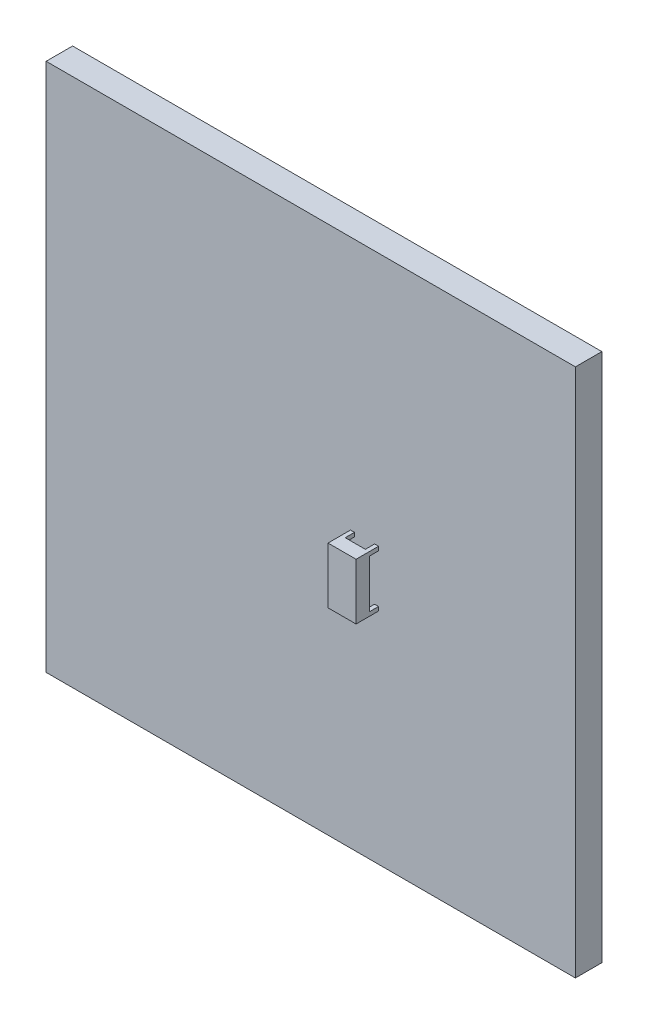
ISO-10303-21;
HEADER;
FILE_DESCRIPTION(('STEP AP214'),'2;1');
FILE_NAME('part.step','',(''),(''),'','','');
FILE_SCHEMA(('AUTOMOTIVE_DESIGN { 1 0 10303 214 1 1 1 1 }'));
ENDSEC;
DATA;
#1=APPLICATION_CONTEXT('core data for automotive mechanical design processes');
#2=APPLICATION_PROTOCOL_DEFINITION('international standard','automotive_design',2000,#1);
#3=PRODUCT_CONTEXT('',#1,'mechanical');
#4=PRODUCT('Part','Part','',(#3));
#5=PRODUCT_RELATED_PRODUCT_CATEGORY('part','',(#4));
#6=PRODUCT_DEFINITION_FORMATION('','',#4);
#7=PRODUCT_DEFINITION_CONTEXT('part definition',#1,'design');
#8=PRODUCT_DEFINITION('design','',#6,#7);
#9=PRODUCT_DEFINITION_SHAPE('','',#8);
#10=(LENGTH_UNIT() NAMED_UNIT(*) SI_UNIT(.MILLI.,.METRE.));
#11=(NAMED_UNIT(*) PLANE_ANGLE_UNIT() SI_UNIT($,.RADIAN.));
#12=(NAMED_UNIT(*) SI_UNIT($,.STERADIAN.) SOLID_ANGLE_UNIT());
#13=UNCERTAINTY_MEASURE_WITH_UNIT(LENGTH_MEASURE(1.E-05),#10,'distance_accuracy_value','');
#14=(GEOMETRIC_REPRESENTATION_CONTEXT(3) GLOBAL_UNCERTAINTY_ASSIGNED_CONTEXT((#13)) GLOBAL_UNIT_ASSIGNED_CONTEXT((#10,
#11,#12)) REPRESENTATION_CONTEXT('',''));
#15=CARTESIAN_POINT('',(0.,0.,0.));
#16=DIRECTION('',(0.,0.,1.));
#17=DIRECTION('',(1.,0.,0.));
#18=AXIS2_PLACEMENT_3D('',#15,#16,#17);
#19=CARTESIAN_POINT('',(0.,0.,0.));
#20=DIRECTION('',(0.,0.,-1.));
#21=DIRECTION('',(-1.,0.,0.));
#22=AXIS2_PLACEMENT_3D('',#19,#20,#21);
#23=PLANE('',#22);
#24=DIRECTION('',(-1.,0.,0.));
#25=VECTOR('',#24,1.);
#26=CARTESIAN_POINT('',(2561.96926289424,-1710.1252122321,0.));
#27=LINE('',#26,#25);
#28=CARTESIAN_POINT('',(2561.96926289424,-1710.1252122321,0.));
#29=VERTEX_POINT('',#28);
#30=CARTESIAN_POINT('',(2411.96926289424,-1710.1252122321,0.));
#31=VERTEX_POINT('',#30);
#32=EDGE_CURVE('E207',#29,#31,#27,.T.);
#33=ORIENTED_EDGE('',*,*,#32,.T.);
#34=DIRECTION('',(0.,1.,0.));
#35=VECTOR('',#34,1.);
#36=CARTESIAN_POINT('',(2411.96926289424,-1710.1252122321,0.));
#37=LINE('',#36,#35);
#38=CARTESIAN_POINT('',(2411.96926289424,-1560.1252122321,0.));
#39=VERTEX_POINT('',#38);
#40=EDGE_CURVE('E209',#31,#39,#37,.T.);
#41=ORIENTED_EDGE('',*,*,#40,.T.);
#42=DIRECTION('',(1.,0.,0.));
#43=VECTOR('',#42,1.);
#44=CARTESIAN_POINT('',(2561.96926289424,-1560.1252122321,0.));
#45=LINE('',#44,#43);
#46=CARTESIAN_POINT('',(2561.96926289424,-1560.1252122321,0.));
#47=VERTEX_POINT('',#46);
#48=EDGE_CURVE('E202',#39,#47,#45,.T.);
#49=ORIENTED_EDGE('',*,*,#48,.T.);
#50=DIRECTION('',(0.,-1.,0.));
#51=VECTOR('',#50,1.);
#52=CARTESIAN_POINT('',(2561.96926289424,-1710.1252122321,0.));
#53=LINE('',#52,#51);
#54=EDGE_CURVE('E203',#47,#29,#53,.T.);
#55=ORIENTED_EDGE('',*,*,#54,.T.);
#56=EDGE_LOOP('',(#33,#41,#49,#55));
#57=FACE_BOUND('',#56,.T.);
#58=DIRECTION('',(-1.,0.,0.));
#59=VECTOR('',#58,1.);
#60=CARTESIAN_POINT('',(2561.96926289424,260.125212232101,0.));
#61=LINE('',#60,#59);
#62=CARTESIAN_POINT('',(2561.96926289424,260.125212232101,0.));
#63=VERTEX_POINT('',#62);
#64=CARTESIAN_POINT('',(2411.96926289424,260.125212232101,0.));
#65=VERTEX_POINT('',#64);
#66=EDGE_CURVE('E292',#63,#65,#61,.T.);
#67=ORIENTED_EDGE('',*,*,#66,.T.);
#68=DIRECTION('',(0.,1.,0.));
#69=VECTOR('',#68,1.);
#70=CARTESIAN_POINT('',(2411.96926289424,410.125212232101,0.));
#71=LINE('',#70,#69);
#72=CARTESIAN_POINT('',(2411.96926289424,410.125212232101,0.));
#73=VERTEX_POINT('',#72);
#74=EDGE_CURVE('E290',#65,#73,#71,.T.);
#75=ORIENTED_EDGE('',*,*,#74,.T.);
#76=DIRECTION('',(1.,0.,0.));
#77=VECTOR('',#76,1.);
#78=CARTESIAN_POINT('',(2561.96926289424,410.125212232101,0.));
#79=LINE('',#78,#77);
#80=CARTESIAN_POINT('',(2561.96926289424,410.125212232101,0.));
#81=VERTEX_POINT('',#80);
#82=EDGE_CURVE('E287',#73,#81,#79,.T.);
#83=ORIENTED_EDGE('',*,*,#82,.T.);
#84=DIRECTION('',(0.,-1.,0.));
#85=VECTOR('',#84,1.);
#86=CARTESIAN_POINT('',(2561.96926289424,410.125212232101,0.));
#87=LINE('',#86,#85);
#88=EDGE_CURVE('E279',#81,#63,#87,.T.);
#89=ORIENTED_EDGE('',*,*,#88,.T.);
#90=EDGE_LOOP('',(#67,#75,#83,#89));
#91=FACE_BOUND('',#90,.T.);
#92=DIRECTION('',(0.,1.,0.));
#93=VECTOR('',#92,1.);
#94=CARTESIAN_POINT('',(10000.,-10000.,0.));
#95=LINE('',#94,#93);
#96=CARTESIAN_POINT('',(10000.,-10000.,0.));
#97=VERTEX_POINT('',#96);
#98=CARTESIAN_POINT('',(10000.,10000.,0.));
#99=VERTEX_POINT('',#98);
#100=EDGE_CURVE('E289',#97,#99,#95,.T.);
#101=ORIENTED_EDGE('',*,*,#100,.T.);
#102=DIRECTION('',(-1.,0.,0.));
#103=VECTOR('',#102,1.);
#104=CARTESIAN_POINT('',(-10000.,10000.,0.));
#105=LINE('',#104,#103);
#106=CARTESIAN_POINT('',(-10000.,10000.,0.));
#107=VERTEX_POINT('',#106);
#108=EDGE_CURVE('E310',#99,#107,#105,.T.);
#109=ORIENTED_EDGE('',*,*,#108,.T.);
#110=DIRECTION('',(0.,-1.,0.));
#111=VECTOR('',#110,1.);
#112=CARTESIAN_POINT('',(-10000.,-10000.,0.));
#113=LINE('',#112,#111);
#114=CARTESIAN_POINT('',(-10000.,-10000.,0.));
#115=VERTEX_POINT('',#114);
#116=EDGE_CURVE('E313',#107,#115,#113,.T.);
#117=ORIENTED_EDGE('',*,*,#116,.T.);
#118=DIRECTION('',(1.,0.,0.));
#119=VECTOR('',#118,1.);
#120=CARTESIAN_POINT('',(-10000.,-10000.,0.));
#121=LINE('',#120,#119);
#122=EDGE_CURVE('E299',#115,#97,#121,.T.);
#123=ORIENTED_EDGE('',*,*,#122,.T.);
#124=EDGE_LOOP('',(#101,#109,#117,#123));
#125=FACE_BOUND('',#124,.T.);
#126=DIRECTION('',(1.,0.,0.));
#127=VECTOR('',#126,1.);
#128=CARTESIAN_POINT('',(1501.84405066214,410.125212232101,0.));
#129=LINE('',#128,#127);
#130=CARTESIAN_POINT('',(1501.84405066214,410.125212232101,0.));
#131=VERTEX_POINT('',#130);
#132=CARTESIAN_POINT('',(1651.84405066214,410.125212232101,0.));
#133=VERTEX_POINT('',#132);
#134=EDGE_CURVE('E229',#131,#133,#129,.T.);
#135=ORIENTED_EDGE('',*,*,#134,.T.);
#136=DIRECTION('',(0.,-1.,0.));
#137=VECTOR('',#136,1.);
#138=CARTESIAN_POINT('',(1651.84405066214,410.125212232101,0.));
#139=LINE('',#138,#137);
#140=CARTESIAN_POINT('',(1651.84405066214,260.125212232101,0.));
#141=VERTEX_POINT('',#140);
#142=EDGE_CURVE('E231',#133,#141,#139,.T.);
#143=ORIENTED_EDGE('',*,*,#142,.T.);
#144=DIRECTION('',(-1.,0.,0.));
#145=VECTOR('',#144,1.);
#146=CARTESIAN_POINT('',(1501.84405066214,260.125212232101,0.));
#147=LINE('',#146,#145);
#148=CARTESIAN_POINT('',(1501.84405066214,260.125212232101,0.));
#149=VERTEX_POINT('',#148);
#150=EDGE_CURVE('E222',#141,#149,#147,.T.);
#151=ORIENTED_EDGE('',*,*,#150,.T.);
#152=DIRECTION('',(0.,1.,0.));
#153=VECTOR('',#152,1.);
#154=CARTESIAN_POINT('',(1501.84405066214,410.125212232101,0.));
#155=LINE('',#154,#153);
#156=EDGE_CURVE('E225',#149,#131,#155,.T.);
#157=ORIENTED_EDGE('',*,*,#156,.T.);
#158=EDGE_LOOP('',(#135,#143,#151,#157));
#159=FACE_BOUND('',#158,.T.);
#160=DIRECTION('',(1.,0.,0.));
#161=VECTOR('',#160,1.);
#162=CARTESIAN_POINT('',(1501.84405066214,-1560.1252122321,0.));
#163=LINE('',#162,#161);
#164=CARTESIAN_POINT('',(1501.84405066214,-1560.1252122321,0.));
#165=VERTEX_POINT('',#164);
#166=CARTESIAN_POINT('',(1651.84405066214,-1560.1252122321,0.));
#167=VERTEX_POINT('',#166);
#168=EDGE_CURVE('E60',#165,#167,#163,.T.);
#169=ORIENTED_EDGE('',*,*,#168,.T.);
#170=DIRECTION('',(0.,-1.,0.));
#171=VECTOR('',#170,1.);
#172=CARTESIAN_POINT('',(1651.84405066214,-1710.1252122321,0.));
#173=LINE('',#172,#171);
#174=CARTESIAN_POINT('',(1651.84405066214,-1710.1252122321,0.));
#175=VERTEX_POINT('',#174);
#176=EDGE_CURVE('E173',#167,#175,#173,.T.);
#177=ORIENTED_EDGE('',*,*,#176,.T.);
#178=DIRECTION('',(-1.,0.,0.));
#179=VECTOR('',#178,1.);
#180=CARTESIAN_POINT('',(1501.84405066214,-1710.1252122321,0.));
#181=LINE('',#180,#179);
#182=CARTESIAN_POINT('',(1501.84405066214,-1710.1252122321,0.));
#183=VERTEX_POINT('',#182);
#184=EDGE_CURVE('E175',#175,#183,#181,.T.);
#185=ORIENTED_EDGE('',*,*,#184,.T.);
#186=DIRECTION('',(0.,1.,0.));
#187=VECTOR('',#186,1.);
#188=CARTESIAN_POINT('',(1501.84405066214,-1710.1252122321,0.));
#189=LINE('',#188,#187);
#190=EDGE_CURVE('E56',#183,#165,#189,.T.);
#191=ORIENTED_EDGE('',*,*,#190,.T.);
#192=EDGE_LOOP('',(#169,#177,#185,#191));
#193=FACE_BOUND('',#192,.T.);
#194=ADVANCED_FACE('F39',(#57,#91,#125,#159,#193),#23,.F.);
#195=CARTESIAN_POINT('',(0.,0.,350.));
#196=DIRECTION('',(0.,0.,-1.));
#197=DIRECTION('',(-1.,0.,0.));
#198=AXIS2_PLACEMENT_3D('',#195,#196,#197);
#199=PLANE('',#198);
#200=DIRECTION('',(0.,-1.,0.));
#201=VECTOR('',#200,1.);
#202=CARTESIAN_POINT('',(1651.84405066214,-1710.1252122321,350.));
#203=LINE('',#202,#201);
#204=CARTESIAN_POINT('',(1651.84405066214,-1560.1252122321,350.));
#205=VERTEX_POINT('',#204);
#206=CARTESIAN_POINT('',(1651.84405066214,-1710.1252122321,350.));
#207=VERTEX_POINT('',#206);
#208=EDGE_CURVE('E191',#205,#207,#203,.T.);
#209=ORIENTED_EDGE('',*,*,#208,.F.);
#210=DIRECTION('',(1.,0.,0.));
#211=VECTOR('',#210,1.);
#212=CARTESIAN_POINT('',(1501.84405066214,-1560.1252122321,350.));
#213=LINE('',#212,#211);
#214=CARTESIAN_POINT('',(1501.84405066214,-1560.1252122321,350.));
#215=VERTEX_POINT('',#214);
#216=EDGE_CURVE('E194',#215,#205,#213,.T.);
#217=ORIENTED_EDGE('',*,*,#216,.F.);
#218=DIRECTION('',(0.,-1.,0.));
#219=VECTOR('',#218,1.);
#220=CARTESIAN_POINT('',(1501.84405066214,-1710.1252122321,350.));
#221=LINE('',#220,#219);
#222=CARTESIAN_POINT('',(1501.84405066214,260.125212232101,350.));
#223=VERTEX_POINT('',#222);
#224=EDGE_CURVE('E261',#223,#215,#221,.T.);
#225=ORIENTED_EDGE('',*,*,#224,.F.);
#226=DIRECTION('',(-1.,0.,0.));
#227=VECTOR('',#226,1.);
#228=CARTESIAN_POINT('',(1501.84405066214,260.125212232101,350.));
#229=LINE('',#228,#227);
#230=CARTESIAN_POINT('',(1651.84405066214,260.125212232101,350.));
#231=VERTEX_POINT('',#230);
#232=EDGE_CURVE('E241',#231,#223,#229,.T.);
#233=ORIENTED_EDGE('',*,*,#232,.F.);
#234=DIRECTION('',(0.,-1.,0.));
#235=VECTOR('',#234,1.);
#236=CARTESIAN_POINT('',(1651.84405066214,410.125212232101,350.));
#237=LINE('',#236,#235);
#238=CARTESIAN_POINT('',(1651.84405066214,410.125212232101,350.));
#239=VERTEX_POINT('',#238);
#240=EDGE_CURVE('E240',#239,#231,#237,.T.);
#241=ORIENTED_EDGE('',*,*,#240,.F.);
#242=DIRECTION('',(-1.,0.,0.));
#243=VECTOR('',#242,1.);
#244=CARTESIAN_POINT('',(1501.84405066214,410.125212232101,350.));
#245=LINE('',#244,#243);
#246=CARTESIAN_POINT('',(2411.96926289424,410.125212232101,350.));
#247=VERTEX_POINT('',#246);
#248=EDGE_CURVE('E258',#247,#239,#245,.T.);
#249=ORIENTED_EDGE('',*,*,#248,.F.);
#250=DIRECTION('',(0.,1.,0.));
#251=VECTOR('',#250,1.);
#252=CARTESIAN_POINT('',(2411.96926289424,410.125212232101,350.));
#253=LINE('',#252,#251);
#254=CARTESIAN_POINT('',(2411.96926289424,260.125212232101,350.));
#255=VERTEX_POINT('',#254);
#256=EDGE_CURVE('E272',#255,#247,#253,.T.);
#257=ORIENTED_EDGE('',*,*,#256,.F.);
#258=DIRECTION('',(-1.,0.,0.));
#259=VECTOR('',#258,1.);
#260=CARTESIAN_POINT('',(2561.96926289424,260.125212232101,350.));
#261=LINE('',#260,#259);
#262=CARTESIAN_POINT('',(2561.96926289424,260.125212232101,350.));
#263=VERTEX_POINT('',#262);
#264=EDGE_CURVE('E269',#263,#255,#261,.T.);
#265=ORIENTED_EDGE('',*,*,#264,.F.);
#266=DIRECTION('',(0.,1.,0.));
#267=VECTOR('',#266,1.);
#268=CARTESIAN_POINT('',(2561.96926289424,-1710.1252122321,350.));
#269=LINE('',#268,#267);
#270=CARTESIAN_POINT('',(2561.96926289424,-1560.1252122321,350.));
#271=VERTEX_POINT('',#270);
#272=EDGE_CURVE('E243',#271,#263,#269,.T.);
#273=ORIENTED_EDGE('',*,*,#272,.F.);
#274=DIRECTION('',(1.,0.,0.));
#275=VECTOR('',#274,1.);
#276=CARTESIAN_POINT('',(2561.96926289424,-1560.1252122321,350.));
#277=LINE('',#276,#275);
#278=CARTESIAN_POINT('',(2411.96926289424,-1560.1252122321,350.));
#279=VERTEX_POINT('',#278);
#280=EDGE_CURVE('E219',#279,#271,#277,.T.);
#281=ORIENTED_EDGE('',*,*,#280,.F.);
#282=DIRECTION('',(0.,1.,0.));
#283=VECTOR('',#282,1.);
#284=CARTESIAN_POINT('',(2411.96926289424,-1710.1252122321,350.));
#285=LINE('',#284,#283);
#286=CARTESIAN_POINT('',(2411.96926289424,-1710.1252122321,350.));
#287=VERTEX_POINT('',#286);
#288=EDGE_CURVE('E218',#287,#279,#285,.T.);
#289=ORIENTED_EDGE('',*,*,#288,.F.);
#290=DIRECTION('',(1.,0.,0.));
#291=VECTOR('',#290,1.);
#292=CARTESIAN_POINT('',(1501.84405066214,-1710.1252122321,350.));
#293=LINE('',#292,#291);
#294=EDGE_CURVE('E250',#207,#287,#293,.T.);
#295=ORIENTED_EDGE('',*,*,#294,.F.);
#296=EDGE_LOOP('',(#209,#217,#225,#233,#241,#249,#257,#265,#273,#281,#289,#295));
#297=FACE_BOUND('',#296,.T.);
#298=ADVANCED_FACE('F346',(#297),#199,.T.);
#299=CARTESIAN_POINT('',(10000.,-10000.,-1000.));
#300=DIRECTION('',(1.,0.,0.));
#301=DIRECTION('',(0.,0.,-1.));
#302=AXIS2_PLACEMENT_3D('',#299,#300,#301);
#303=PLANE('',#302);
#304=ORIENTED_EDGE('',*,*,#100,.F.);
#305=DIRECTION('',(0.,0.,1.));
#306=VECTOR('',#305,1.);
#307=CARTESIAN_POINT('',(10000.,-10000.,-1000.));
#308=LINE('',#307,#306);
#309=CARTESIAN_POINT('',(10000.,-10000.,-1000.));
#310=VERTEX_POINT('',#309);
#311=EDGE_CURVE('E11',#310,#97,#308,.T.);
#312=ORIENTED_EDGE('',*,*,#311,.F.);
#313=DIRECTION('',(0.,1.,0.));
#314=VECTOR('',#313,1.);
#315=CARTESIAN_POINT('',(10000.,-10000.,-1000.));
#316=LINE('',#315,#314);
#317=CARTESIAN_POINT('',(10000.,10000.,-1000.));
#318=VERTEX_POINT('',#317);
#319=EDGE_CURVE('E295',#310,#318,#316,.T.);
#320=ORIENTED_EDGE('',*,*,#319,.T.);
#321=DIRECTION('',(0.,0.,1.));
#322=VECTOR('',#321,1.);
#323=CARTESIAN_POINT('',(10000.,10000.,-1000.));
#324=LINE('',#323,#322);
#325=EDGE_CURVE('E43',#318,#99,#324,.T.);
#326=ORIENTED_EDGE('',*,*,#325,.T.);
#327=EDGE_LOOP('',(#304,#312,#320,#326));
#328=FACE_BOUND('',#327,.T.);
#329=ADVANCED_FACE('F41',(#328),#303,.T.);
#330=CARTESIAN_POINT('',(-10000.,-10000.,-1000.));
#331=DIRECTION('',(0.,-1.,0.));
#332=DIRECTION('',(0.,0.,-1.));
#333=AXIS2_PLACEMENT_3D('',#330,#331,#332);
#334=PLANE('',#333);
#335=ORIENTED_EDGE('',*,*,#122,.F.);
#336=DIRECTION('',(0.,0.,1.));
#337=VECTOR('',#336,1.);
#338=CARTESIAN_POINT('',(-10000.,-10000.,-1000.));
#339=LINE('',#338,#337);
#340=CARTESIAN_POINT('',(-10000.,-10000.,-1000.));
#341=VERTEX_POINT('',#340);
#342=EDGE_CURVE('E48',#341,#115,#339,.T.);
#343=ORIENTED_EDGE('',*,*,#342,.F.);
#344=DIRECTION('',(1.,0.,0.));
#345=VECTOR('',#344,1.);
#346=CARTESIAN_POINT('',(-10000.,-10000.,-1000.));
#347=LINE('',#346,#345);
#348=EDGE_CURVE('E305',#341,#310,#347,.T.);
#349=ORIENTED_EDGE('',*,*,#348,.T.);
#350=ORIENTED_EDGE('',*,*,#311,.T.);
#351=EDGE_LOOP('',(#335,#343,#349,#350));
#352=FACE_BOUND('',#351,.T.);
#353=ADVANCED_FACE('F331',(#352),#334,.T.);
#354=CARTESIAN_POINT('',(-10000.,-10000.,-1000.));
#355=DIRECTION('',(-1.,0.,0.));
#356=DIRECTION('',(0.,0.,1.));
#357=AXIS2_PLACEMENT_3D('',#354,#355,#356);
#358=PLANE('',#357);
#359=ORIENTED_EDGE('',*,*,#116,.F.);
#360=DIRECTION('',(0.,0.,1.));
#361=VECTOR('',#360,1.);
#362=CARTESIAN_POINT('',(-10000.,10000.,-1000.));
#363=LINE('',#362,#361);
#364=CARTESIAN_POINT('',(-10000.,10000.,-1000.));
#365=VERTEX_POINT('',#364);
#366=EDGE_CURVE('E318',#365,#107,#363,.T.);
#367=ORIENTED_EDGE('',*,*,#366,.F.);
#368=DIRECTION('',(0.,-1.,0.));
#369=VECTOR('',#368,1.);
#370=CARTESIAN_POINT('',(-10000.,-10000.,-1000.));
#371=LINE('',#370,#369);
#372=EDGE_CURVE('E302',#365,#341,#371,.T.);
#373=ORIENTED_EDGE('',*,*,#372,.T.);
#374=ORIENTED_EDGE('',*,*,#342,.T.);
#375=EDGE_LOOP('',(#359,#367,#373,#374));
#376=FACE_BOUND('',#375,.T.);
#377=ADVANCED_FACE('F337',(#376),#358,.T.);
#378=CARTESIAN_POINT('',(-10000.,10000.,-1000.));
#379=DIRECTION('',(0.,1.,0.));
#380=DIRECTION('',(0.,0.,1.));
#381=AXIS2_PLACEMENT_3D('',#378,#379,#380);
#382=PLANE('',#381);
#383=ORIENTED_EDGE('',*,*,#108,.F.);
#384=ORIENTED_EDGE('',*,*,#325,.F.);
#385=DIRECTION('',(-1.,0.,0.));
#386=VECTOR('',#385,1.);
#387=CARTESIAN_POINT('',(-10000.,10000.,-1000.));
#388=LINE('',#387,#386);
#389=EDGE_CURVE('E298',#318,#365,#388,.T.);
#390=ORIENTED_EDGE('',*,*,#389,.T.);
#391=ORIENTED_EDGE('',*,*,#366,.T.);
#392=EDGE_LOOP('',(#383,#384,#390,#391));
#393=FACE_BOUND('',#392,.T.);
#394=ADVANCED_FACE('F326',(#393),#382,.T.);
#395=CARTESIAN_POINT('',(0.,0.,-1000.));
#396=DIRECTION('',(0.,0.,-1.));
#397=DIRECTION('',(-1.,0.,0.));
#398=AXIS2_PLACEMENT_3D('',#395,#396,#397);
#399=PLANE('',#398);
#400=ORIENTED_EDGE('',*,*,#319,.F.);
#401=ORIENTED_EDGE('',*,*,#348,.F.);
#402=ORIENTED_EDGE('',*,*,#372,.F.);
#403=ORIENTED_EDGE('',*,*,#389,.F.);
#404=EDGE_LOOP('',(#400,#401,#402,#403));
#405=FACE_BOUND('',#404,.T.);
#406=ADVANCED_FACE('F334',(#405),#399,.T.);
#407=CARTESIAN_POINT('',(2561.96926289424,260.125212232101,-1000.002));
#408=DIRECTION('',(0.,1.,0.));
#409=DIRECTION('',(0.,0.,1.));
#410=AXIS2_PLACEMENT_3D('',#407,#408,#409);
#411=PLANE('',#410);
#412=ORIENTED_EDGE('',*,*,#66,.F.);
#413=DIRECTION('',(0.,0.,1.));
#414=VECTOR('',#413,1.);
#415=CARTESIAN_POINT('',(2561.96926289424,260.125212232101,-1000.002));
#416=LINE('',#415,#414);
#417=EDGE_CURVE('E276',#63,#263,#416,.T.);
#418=ORIENTED_EDGE('',*,*,#417,.T.);
#419=ORIENTED_EDGE('',*,*,#264,.T.);
#420=DIRECTION('',(0.,0.,1.));
#421=VECTOR('',#420,1.);
#422=CARTESIAN_POINT('',(2411.96926289424,260.125212232101,-1000.002));
#423=LINE('',#422,#421);
#424=EDGE_CURVE('E280',#65,#255,#423,.T.);
#425=ORIENTED_EDGE('',*,*,#424,.F.);
#426=EDGE_LOOP('',(#412,#418,#419,#425));
#427=FACE_BOUND('',#426,.T.);
#428=ADVANCED_FACE('F358',(#427),#411,.F.);
#429=CARTESIAN_POINT('',(2561.96926289424,410.125212232101,-1000.002));
#430=DIRECTION('',(-1.,0.,0.));
#431=DIRECTION('',(0.,0.,1.));
#432=AXIS2_PLACEMENT_3D('',#429,#430,#431);
#433=PLANE('',#432);
#434=ORIENTED_EDGE('',*,*,#88,.F.);
#435=DIRECTION('',(0.,0.,1.));
#436=VECTOR('',#435,1.);
#437=CARTESIAN_POINT('',(2561.96926289424,410.125212232101,-1000.002));
#438=LINE('',#437,#436);
#439=CARTESIAN_POINT('',(2561.96926289424,410.125212232101,850.));
#440=VERTEX_POINT('',#439);
#441=EDGE_CURVE('E275',#81,#440,#438,.T.);
#442=ORIENTED_EDGE('',*,*,#441,.T.);
#443=DIRECTION('',(0.,1.,0.));
#444=VECTOR('',#443,1.);
#445=CARTESIAN_POINT('',(2561.96926289424,-1710.1252122321,850.));
#446=LINE('',#445,#444);
#447=CARTESIAN_POINT('',(2561.96926289424,-1710.1252122321,850.));
#448=VERTEX_POINT('',#447);
#449=EDGE_CURVE('E246',#448,#440,#446,.T.);
#450=ORIENTED_EDGE('',*,*,#449,.F.);
#451=DIRECTION('',(0.,0.,-1.));
#452=VECTOR('',#451,1.);
#453=CARTESIAN_POINT('',(2561.96926289424,-1710.1252122321,850.));
#454=LINE('',#453,#452);
#455=EDGE_CURVE('E256',#448,#29,#454,.T.);
#456=ORIENTED_EDGE('',*,*,#455,.T.);
#457=ORIENTED_EDGE('',*,*,#54,.F.);
#458=DIRECTION('',(0.,0.,1.));
#459=VECTOR('',#458,1.);
#460=CARTESIAN_POINT('',(2561.96926289424,-1560.1252122321,-1000.002));
#461=LINE('',#460,#459);
#462=EDGE_CURVE('E216',#47,#271,#461,.T.);
#463=ORIENTED_EDGE('',*,*,#462,.T.);
#464=ORIENTED_EDGE('',*,*,#272,.T.);
#465=ORIENTED_EDGE('',*,*,#417,.F.);
#466=EDGE_LOOP('',(#434,#442,#450,#456,#457,#463,#464,#465));
#467=FACE_BOUND('',#466,.T.);
#468=ADVANCED_FACE('F360',(#467),#433,.F.);
#469=CARTESIAN_POINT('',(2411.96926289424,410.125212232101,-1000.002));
#470=DIRECTION('',(1.,0.,0.));
#471=DIRECTION('',(0.,0.,-1.));
#472=AXIS2_PLACEMENT_3D('',#469,#470,#471);
#473=PLANE('',#472);
#474=ORIENTED_EDGE('',*,*,#74,.F.);
#475=ORIENTED_EDGE('',*,*,#424,.T.);
#476=ORIENTED_EDGE('',*,*,#256,.T.);
#477=DIRECTION('',(0.,0.,1.));
#478=VECTOR('',#477,1.);
#479=CARTESIAN_POINT('',(2411.96926289424,410.125212232101,-1000.002));
#480=LINE('',#479,#478);
#481=EDGE_CURVE('E283',#73,#247,#480,.T.);
#482=ORIENTED_EDGE('',*,*,#481,.F.);
#483=EDGE_LOOP('',(#474,#475,#476,#482));
#484=FACE_BOUND('',#483,.T.);
#485=ADVANCED_FACE('F363',(#484),#473,.F.);
#486=CARTESIAN_POINT('',(2561.96926289424,410.125212232101,-1000.002));
#487=DIRECTION('',(0.,-1.,0.));
#488=DIRECTION('',(0.,0.,-1.));
#489=AXIS2_PLACEMENT_3D('',#486,#487,#488);
#490=PLANE('',#489);
#491=ORIENTED_EDGE('',*,*,#82,.F.);
#492=ORIENTED_EDGE('',*,*,#481,.T.);
#493=ORIENTED_EDGE('',*,*,#248,.T.);
#494=DIRECTION('',(0.,0.,1.));
#495=VECTOR('',#494,1.);
#496=CARTESIAN_POINT('',(1651.84405066214,410.125212232101,-1000.002));
#497=LINE('',#496,#495);
#498=EDGE_CURVE('E228',#133,#239,#497,.T.);
#499=ORIENTED_EDGE('',*,*,#498,.F.);
#500=ORIENTED_EDGE('',*,*,#134,.F.);
#501=DIRECTION('',(0.,0.,-1.));
#502=VECTOR('',#501,1.);
#503=CARTESIAN_POINT('',(1501.84405066214,410.125212232101,850.));
#504=LINE('',#503,#502);
#505=CARTESIAN_POINT('',(1501.84405066214,410.125212232101,850.));
#506=VERTEX_POINT('',#505);
#507=EDGE_CURVE('E267',#506,#131,#504,.T.);
#508=ORIENTED_EDGE('',*,*,#507,.F.);
#509=DIRECTION('',(-1.,0.,0.));
#510=VECTOR('',#509,1.);
#511=CARTESIAN_POINT('',(1501.84405066214,410.125212232101,850.));
#512=LINE('',#511,#510);
#513=EDGE_CURVE('E249',#440,#506,#512,.T.);
#514=ORIENTED_EDGE('',*,*,#513,.F.);
#515=ORIENTED_EDGE('',*,*,#441,.F.);
#516=EDGE_LOOP('',(#491,#492,#493,#499,#500,#508,#514,#515));
#517=FACE_BOUND('',#516,.T.);
#518=ADVANCED_FACE('F359',(#517),#490,.F.);
#519=CARTESIAN_POINT('',(1501.84405066214,-1710.1252122321,850.));
#520=DIRECTION('',(1.,0.,0.));
#521=DIRECTION('',(0.,0.,-1.));
#522=AXIS2_PLACEMENT_3D('',#519,#520,#521);
#523=PLANE('',#522);
#524=ORIENTED_EDGE('',*,*,#507,.T.);
#525=ORIENTED_EDGE('',*,*,#156,.F.);
#526=DIRECTION('',(0.,0.,1.));
#527=VECTOR('',#526,1.);
#528=CARTESIAN_POINT('',(1501.84405066214,260.125212232101,-1000.002));
#529=LINE('',#528,#527);
#530=EDGE_CURVE('E237',#149,#223,#529,.T.);
#531=ORIENTED_EDGE('',*,*,#530,.T.);
#532=ORIENTED_EDGE('',*,*,#224,.T.);
#533=DIRECTION('',(0.,0.,1.));
#534=VECTOR('',#533,1.);
#535=CARTESIAN_POINT('',(1501.84405066214,-1560.1252122321,-1000.002));
#536=LINE('',#535,#534);
#537=EDGE_CURVE('E196',#165,#215,#536,.T.);
#538=ORIENTED_EDGE('',*,*,#537,.F.);
#539=ORIENTED_EDGE('',*,*,#190,.F.);
#540=DIRECTION('',(0.,0.,-1.));
#541=VECTOR('',#540,1.);
#542=CARTESIAN_POINT('',(1501.84405066214,-1710.1252122321,850.));
#543=LINE('',#542,#541);
#544=CARTESIAN_POINT('',(1501.84405066214,-1710.1252122321,850.));
#545=VERTEX_POINT('',#544);
#546=EDGE_CURVE('E187',#545,#183,#543,.T.);
#547=ORIENTED_EDGE('',*,*,#546,.F.);
#548=DIRECTION('',(0.,-1.,0.));
#549=VECTOR('',#548,1.);
#550=CARTESIAN_POINT('',(1501.84405066214,-1710.1252122321,850.));
#551=LINE('',#550,#549);
#552=EDGE_CURVE('E252',#506,#545,#551,.T.);
#553=ORIENTED_EDGE('',*,*,#552,.F.);
#554=EDGE_LOOP('',(#524,#525,#531,#532,#538,#539,#547,#553));
#555=FACE_BOUND('',#554,.T.);
#556=ADVANCED_FACE('F368',(#555),#523,.F.);
#557=CARTESIAN_POINT('',(1501.84405066214,-1710.1252122321,850.));
#558=DIRECTION('',(0.,1.,0.));
#559=DIRECTION('',(0.,0.,1.));
#560=AXIS2_PLACEMENT_3D('',#557,#558,#559);
#561=PLANE('',#560);
#562=ORIENTED_EDGE('',*,*,#546,.T.);
#563=ORIENTED_EDGE('',*,*,#184,.F.);
#564=DIRECTION('',(0.,0.,1.));
#565=VECTOR('',#564,1.);
#566=CARTESIAN_POINT('',(1651.84405066214,-1710.1252122321,-1000.002));
#567=LINE('',#566,#565);
#568=EDGE_CURVE('E183',#175,#207,#567,.T.);
#569=ORIENTED_EDGE('',*,*,#568,.T.);
#570=ORIENTED_EDGE('',*,*,#294,.T.);
#571=DIRECTION('',(0.,0.,1.));
#572=VECTOR('',#571,1.);
#573=CARTESIAN_POINT('',(2411.96926289424,-1710.1252122321,-1000.002));
#574=LINE('',#573,#572);
#575=EDGE_CURVE('E206',#31,#287,#574,.T.);
#576=ORIENTED_EDGE('',*,*,#575,.F.);
#577=ORIENTED_EDGE('',*,*,#32,.F.);
#578=ORIENTED_EDGE('',*,*,#455,.F.);
#579=DIRECTION('',(1.,0.,0.));
#580=VECTOR('',#579,1.);
#581=CARTESIAN_POINT('',(1501.84405066214,-1710.1252122321,850.));
#582=LINE('',#581,#580);
#583=EDGE_CURVE('E254',#545,#448,#582,.T.);
#584=ORIENTED_EDGE('',*,*,#583,.F.);
#585=EDGE_LOOP('',(#562,#563,#569,#570,#576,#577,#578,#584));
#586=FACE_BOUND('',#585,.T.);
#587=ADVANCED_FACE('F182',(#586),#561,.F.);
#588=CARTESIAN_POINT('',(0.,0.,850.));
#589=DIRECTION('',(0.,0.,-1.));
#590=DIRECTION('',(-1.,0.,0.));
#591=AXIS2_PLACEMENT_3D('',#588,#589,#590);
#592=PLANE('',#591);
#593=ORIENTED_EDGE('',*,*,#449,.T.);
#594=ORIENTED_EDGE('',*,*,#513,.T.);
#595=ORIENTED_EDGE('',*,*,#552,.T.);
#596=ORIENTED_EDGE('',*,*,#583,.T.);
#597=EDGE_LOOP('',(#593,#594,#595,#596));
#598=FACE_BOUND('',#597,.T.);
#599=ADVANCED_FACE('F379',(#598),#592,.F.);
#600=CARTESIAN_POINT('',(1651.84405066214,410.125212232101,-1000.002));
#601=DIRECTION('',(-1.,0.,0.));
#602=DIRECTION('',(0.,0.,1.));
#603=AXIS2_PLACEMENT_3D('',#600,#601,#602);
#604=PLANE('',#603);
#605=ORIENTED_EDGE('',*,*,#142,.F.);
#606=ORIENTED_EDGE('',*,*,#498,.T.);
#607=ORIENTED_EDGE('',*,*,#240,.T.);
#608=DIRECTION('',(0.,0.,1.));
#609=VECTOR('',#608,1.);
#610=CARTESIAN_POINT('',(1651.84405066214,260.125212232101,-1000.002));
#611=LINE('',#610,#609);
#612=EDGE_CURVE('E235',#141,#231,#611,.T.);
#613=ORIENTED_EDGE('',*,*,#612,.F.);
#614=EDGE_LOOP('',(#605,#606,#607,#613));
#615=FACE_BOUND('',#614,.T.);
#616=ADVANCED_FACE('F383',(#615),#604,.F.);
#617=CARTESIAN_POINT('',(1501.84405066214,260.125212232101,-1000.002));
#618=DIRECTION('',(0.,1.,0.));
#619=DIRECTION('',(0.,0.,1.));
#620=AXIS2_PLACEMENT_3D('',#617,#618,#619);
#621=PLANE('',#620);
#622=ORIENTED_EDGE('',*,*,#150,.F.);
#623=ORIENTED_EDGE('',*,*,#612,.T.);
#624=ORIENTED_EDGE('',*,*,#232,.T.);
#625=ORIENTED_EDGE('',*,*,#530,.F.);
#626=EDGE_LOOP('',(#622,#623,#624,#625));
#627=FACE_BOUND('',#626,.T.);
#628=ADVANCED_FACE('F385',(#627),#621,.F.);
#629=CARTESIAN_POINT('',(2411.96926289424,-1710.1252122321,-1000.002));
#630=DIRECTION('',(1.,0.,0.));
#631=DIRECTION('',(0.,0.,-1.));
#632=AXIS2_PLACEMENT_3D('',#629,#630,#631);
#633=PLANE('',#632);
#634=ORIENTED_EDGE('',*,*,#40,.F.);
#635=ORIENTED_EDGE('',*,*,#575,.T.);
#636=ORIENTED_EDGE('',*,*,#288,.T.);
#637=DIRECTION('',(0.,0.,1.));
#638=VECTOR('',#637,1.);
#639=CARTESIAN_POINT('',(2411.96926289424,-1560.1252122321,-1000.002));
#640=LINE('',#639,#638);
#641=EDGE_CURVE('E214',#39,#279,#640,.T.);
#642=ORIENTED_EDGE('',*,*,#641,.F.);
#643=EDGE_LOOP('',(#634,#635,#636,#642));
#644=FACE_BOUND('',#643,.T.);
#645=ADVANCED_FACE('F392',(#644),#633,.F.);
#646=CARTESIAN_POINT('',(2561.96926289424,-1560.1252122321,-1000.002));
#647=DIRECTION('',(0.,-1.,0.));
#648=DIRECTION('',(0.,0.,-1.));
#649=AXIS2_PLACEMENT_3D('',#646,#647,#648);
#650=PLANE('',#649);
#651=ORIENTED_EDGE('',*,*,#48,.F.);
#652=ORIENTED_EDGE('',*,*,#641,.T.);
#653=ORIENTED_EDGE('',*,*,#280,.T.);
#654=ORIENTED_EDGE('',*,*,#462,.F.);
#655=EDGE_LOOP('',(#651,#652,#653,#654));
#656=FACE_BOUND('',#655,.T.);
#657=ADVANCED_FACE('F389',(#656),#650,.F.);
#658=CARTESIAN_POINT('',(1501.84405066214,-1560.1252122321,-1000.002));
#659=DIRECTION('',(0.,-1.,0.));
#660=DIRECTION('',(0.,0.,-1.));
#661=AXIS2_PLACEMENT_3D('',#658,#659,#660);
#662=PLANE('',#661);
#663=ORIENTED_EDGE('',*,*,#168,.F.);
#664=ORIENTED_EDGE('',*,*,#537,.T.);
#665=ORIENTED_EDGE('',*,*,#216,.T.);
#666=DIRECTION('',(0.,0.,1.));
#667=VECTOR('',#666,1.);
#668=CARTESIAN_POINT('',(1651.84405066214,-1560.1252122321,-1000.002));
#669=LINE('',#668,#667);
#670=EDGE_CURVE('E192',#167,#205,#669,.T.);
#671=ORIENTED_EDGE('',*,*,#670,.F.);
#672=EDGE_LOOP('',(#663,#664,#665,#671));
#673=FACE_BOUND('',#672,.T.);
#674=ADVANCED_FACE('F399',(#673),#662,.F.);
#675=CARTESIAN_POINT('',(1651.84405066214,-1710.1252122321,-1000.002));
#676=DIRECTION('',(-1.,0.,0.));
#677=DIRECTION('',(0.,0.,1.));
#678=AXIS2_PLACEMENT_3D('',#675,#676,#677);
#679=PLANE('',#678);
#680=ORIENTED_EDGE('',*,*,#176,.F.);
#681=ORIENTED_EDGE('',*,*,#670,.T.);
#682=ORIENTED_EDGE('',*,*,#208,.T.);
#683=ORIENTED_EDGE('',*,*,#568,.F.);
#684=EDGE_LOOP('',(#680,#681,#682,#683));
#685=FACE_BOUND('',#684,.T.);
#686=ADVANCED_FACE('F189',(#685),#679,.F.);
#687=CLOSED_SHELL('',(#194,#298,#329,#353,#377,#394,#406,#428,#468,#485,#518,#556,#587,#599,
#616,#628,#645,#657,#674,#686));
#688=MANIFOLD_SOLID_BREP('B2',#687);
#689=ADVANCED_BREP_SHAPE_REPRESENTATION('',(#18,#688),#14);
#690=SHAPE_DEFINITION_REPRESENTATION(#9,#689);
ENDSEC;
END-ISO-10303-21;
